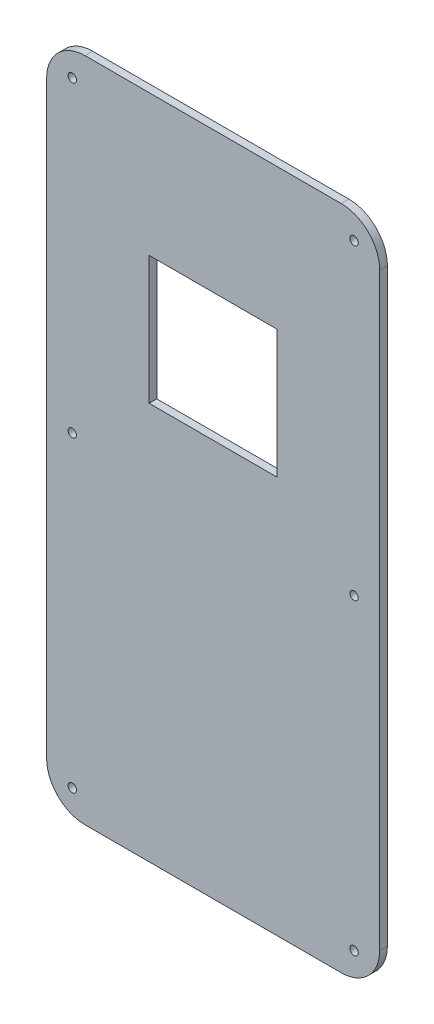
ISO-10303-21;
HEADER;
FILE_DESCRIPTION(('STEP AP214'),'2;1');
FILE_NAME('part.step','',(''),(''),'','','');
FILE_SCHEMA(('AUTOMOTIVE_DESIGN { 1 0 10303 214 1 1 1 1 }'));
ENDSEC;
DATA;
#1=APPLICATION_CONTEXT('core data for automotive mechanical design processes');
#2=APPLICATION_PROTOCOL_DEFINITION('international standard','automotive_design',2000,#1);
#3=PRODUCT_CONTEXT('',#1,'mechanical');
#4=PRODUCT('Part','Part','',(#3));
#5=PRODUCT_RELATED_PRODUCT_CATEGORY('part','',(#4));
#6=PRODUCT_DEFINITION_FORMATION('','',#4);
#7=PRODUCT_DEFINITION_CONTEXT('part definition',#1,'design');
#8=PRODUCT_DEFINITION('design','',#6,#7);
#9=PRODUCT_DEFINITION_SHAPE('','',#8);
#10=(LENGTH_UNIT() NAMED_UNIT(*) SI_UNIT(.MILLI.,.METRE.));
#11=(NAMED_UNIT(*) PLANE_ANGLE_UNIT() SI_UNIT($,.RADIAN.));
#12=(NAMED_UNIT(*) SI_UNIT($,.STERADIAN.) SOLID_ANGLE_UNIT());
#13=UNCERTAINTY_MEASURE_WITH_UNIT(LENGTH_MEASURE(1.E-05),#10,'distance_accuracy_value','');
#14=(GEOMETRIC_REPRESENTATION_CONTEXT(3) GLOBAL_UNCERTAINTY_ASSIGNED_CONTEXT((#13)) GLOBAL_UNIT_ASSIGNED_CONTEXT((#10,
#11,#12)) REPRESENTATION_CONTEXT('',''));
#15=CARTESIAN_POINT('',(0.,0.,0.));
#16=DIRECTION('',(0.,0.,1.));
#17=DIRECTION('',(1.,0.,0.));
#18=AXIS2_PLACEMENT_3D('',#15,#16,#17);
#19=CARTESIAN_POINT('',(0.,0.,3.));
#20=DIRECTION('',(-1.,0.,0.));
#21=DIRECTION('',(0.,0.,1.));
#22=AXIS2_PLACEMENT_3D('',#19,#20,#21);
#23=PLANE('',#22);
#24=DIRECTION('',(0.,1.,0.));
#25=VECTOR('',#24,1.);
#26=CARTESIAN_POINT('',(0.,0.,3.));
#27=LINE('',#26,#25);
#28=CARTESIAN_POINT('',(0.,15.,3.));
#29=VERTEX_POINT('',#28);
#30=CARTESIAN_POINT('',(0.,245.,3.));
#31=VERTEX_POINT('',#30);
#32=EDGE_CURVE('E210',#29,#31,#27,.T.);
#33=ORIENTED_EDGE('',*,*,#32,.T.);
#34=DIRECTION('',(0.,0.,-1.));
#35=VECTOR('',#34,1.);
#36=CARTESIAN_POINT('',(0.,245.,3.));
#37=LINE('',#36,#35);
#38=CARTESIAN_POINT('',(0.,245.,0.));
#39=VERTEX_POINT('',#38);
#40=EDGE_CURVE('E232',#31,#39,#37,.T.);
#41=ORIENTED_EDGE('',*,*,#40,.T.);
#42=DIRECTION('',(0.,1.,0.));
#43=VECTOR('',#42,1.);
#44=CARTESIAN_POINT('',(0.,0.,0.));
#45=LINE('',#44,#43);
#46=CARTESIAN_POINT('',(0.,15.,0.));
#47=VERTEX_POINT('',#46);
#48=EDGE_CURVE('E207',#47,#39,#45,.T.);
#49=ORIENTED_EDGE('',*,*,#48,.F.);
#50=DIRECTION('',(0.,0.,-1.));
#51=VECTOR('',#50,1.);
#52=CARTESIAN_POINT('',(0.,15.,3.));
#53=LINE('',#52,#51);
#54=EDGE_CURVE('E221',#47,#29,#53,.F.);
#55=ORIENTED_EDGE('',*,*,#54,.T.);
#56=EDGE_LOOP('',(#33,#41,#49,#55));
#57=FACE_BOUND('',#56,.T.);
#58=ADVANCED_FACE('F39',(#57),#23,.T.);
#59=CARTESIAN_POINT('',(0.,0.,3.));
#60=DIRECTION('',(0.,1.,0.));
#61=DIRECTION('',(0.,0.,1.));
#62=AXIS2_PLACEMENT_3D('',#59,#60,#61);
#63=PLANE('',#62);
#64=DIRECTION('',(1.,0.,0.));
#65=VECTOR('',#64,1.);
#66=CARTESIAN_POINT('',(0.,0.,3.));
#67=LINE('',#66,#65);
#68=CARTESIAN_POINT('',(15.,0.,3.));
#69=VERTEX_POINT('',#68);
#70=CARTESIAN_POINT('',(115.,0.,3.));
#71=VERTEX_POINT('',#70);
#72=EDGE_CURVE('E219',#69,#71,#67,.T.);
#73=ORIENTED_EDGE('',*,*,#72,.F.);
#74=DIRECTION('',(0.,0.,-1.));
#75=VECTOR('',#74,1.);
#76=CARTESIAN_POINT('',(15.,0.,0.));
#77=LINE('',#76,#75);
#78=CARTESIAN_POINT('',(15.,0.,0.));
#79=VERTEX_POINT('',#78);
#80=EDGE_CURVE('E257',#69,#79,#77,.T.);
#81=ORIENTED_EDGE('',*,*,#80,.T.);
#82=DIRECTION('',(1.,0.,0.));
#83=VECTOR('',#82,1.);
#84=CARTESIAN_POINT('',(0.,0.,0.));
#85=LINE('',#84,#83);
#86=CARTESIAN_POINT('',(115.,0.,0.));
#87=VERTEX_POINT('',#86);
#88=EDGE_CURVE('E214',#79,#87,#85,.T.);
#89=ORIENTED_EDGE('',*,*,#88,.T.);
#90=DIRECTION('',(0.,0.,-1.));
#91=VECTOR('',#90,1.);
#92=CARTESIAN_POINT('',(115.,0.,3.));
#93=LINE('',#92,#91);
#94=EDGE_CURVE('E255',#87,#71,#93,.F.);
#95=ORIENTED_EDGE('',*,*,#94,.T.);
#96=EDGE_LOOP('',(#73,#81,#89,#95));
#97=FACE_BOUND('',#96,.T.);
#98=ADVANCED_FACE('F263',(#97),#63,.F.);
#99=CARTESIAN_POINT('',(130.,0.,3.));
#100=DIRECTION('',(-1.,0.,0.));
#101=DIRECTION('',(0.,0.,1.));
#102=AXIS2_PLACEMENT_3D('',#99,#100,#101);
#103=PLANE('',#102);
#104=DIRECTION('',(0.,1.,0.));
#105=VECTOR('',#104,1.);
#106=CARTESIAN_POINT('',(130.,0.,3.));
#107=LINE('',#106,#105);
#108=CARTESIAN_POINT('',(130.,15.,3.));
#109=VERTEX_POINT('',#108);
#110=CARTESIAN_POINT('',(130.,245.,3.));
#111=VERTEX_POINT('',#110);
#112=EDGE_CURVE('E217',#109,#111,#107,.T.);
#113=ORIENTED_EDGE('',*,*,#112,.F.);
#114=DIRECTION('',(0.,0.,-1.));
#115=VECTOR('',#114,1.);
#116=CARTESIAN_POINT('',(130.,15.,3.));
#117=LINE('',#116,#115);
#118=CARTESIAN_POINT('',(130.,15.,0.));
#119=VERTEX_POINT('',#118);
#120=EDGE_CURVE('E11',#109,#119,#117,.T.);
#121=ORIENTED_EDGE('',*,*,#120,.T.);
#122=DIRECTION('',(0.,1.,0.));
#123=VECTOR('',#122,1.);
#124=CARTESIAN_POINT('',(130.,0.,0.));
#125=LINE('',#124,#123);
#126=CARTESIAN_POINT('',(130.,245.,0.));
#127=VERTEX_POINT('',#126);
#128=EDGE_CURVE('E227',#119,#127,#125,.T.);
#129=ORIENTED_EDGE('',*,*,#128,.T.);
#130=DIRECTION('',(0.,0.,-1.));
#131=VECTOR('',#130,1.);
#132=CARTESIAN_POINT('',(130.,245.,3.));
#133=LINE('',#132,#131);
#134=EDGE_CURVE('E47',#127,#111,#133,.F.);
#135=ORIENTED_EDGE('',*,*,#134,.T.);
#136=EDGE_LOOP('',(#113,#121,#129,#135));
#137=FACE_BOUND('',#136,.T.);
#138=ADVANCED_FACE('F273',(#137),#103,.F.);
#139=CARTESIAN_POINT('',(0.,260.,3.));
#140=DIRECTION('',(0.,1.,0.));
#141=DIRECTION('',(0.,0.,1.));
#142=AXIS2_PLACEMENT_3D('',#139,#140,#141);
#143=PLANE('',#142);
#144=DIRECTION('',(1.,0.,0.));
#145=VECTOR('',#144,1.);
#146=CARTESIAN_POINT('',(0.,260.,0.));
#147=LINE('',#146,#145);
#148=CARTESIAN_POINT('',(15.,260.,0.));
#149=VERTEX_POINT('',#148);
#150=CARTESIAN_POINT('',(115.,260.,0.));
#151=VERTEX_POINT('',#150);
#152=EDGE_CURVE('E224',#149,#151,#147,.T.);
#153=ORIENTED_EDGE('',*,*,#152,.F.);
#154=DIRECTION('',(0.,0.,-1.));
#155=VECTOR('',#154,1.);
#156=CARTESIAN_POINT('',(15.,260.,3.));
#157=LINE('',#156,#155);
#158=CARTESIAN_POINT('',(15.,260.,3.));
#159=VERTEX_POINT('',#158);
#160=EDGE_CURVE('E246',#149,#159,#157,.F.);
#161=ORIENTED_EDGE('',*,*,#160,.T.);
#162=DIRECTION('',(1.,0.,0.));
#163=VECTOR('',#162,1.);
#164=CARTESIAN_POINT('',(0.,260.,3.));
#165=LINE('',#164,#163);
#166=CARTESIAN_POINT('',(115.,260.,3.));
#167=VERTEX_POINT('',#166);
#168=EDGE_CURVE('E213',#159,#167,#165,.T.);
#169=ORIENTED_EDGE('',*,*,#168,.T.);
#170=DIRECTION('',(0.,0.,-1.));
#171=VECTOR('',#170,1.);
#172=CARTESIAN_POINT('',(115.,260.,0.));
#173=LINE('',#172,#171);
#174=EDGE_CURVE('E243',#167,#151,#173,.T.);
#175=ORIENTED_EDGE('',*,*,#174,.T.);
#176=EDGE_LOOP('',(#153,#161,#169,#175));
#177=FACE_BOUND('',#176,.T.);
#178=ADVANCED_FACE('F281',(#177),#143,.T.);
#179=CARTESIAN_POINT('',(0.,0.,3.));
#180=DIRECTION('',(0.,0.,-1.));
#181=DIRECTION('',(-1.,0.,0.));
#182=AXIS2_PLACEMENT_3D('',#179,#180,#181);
#183=PLANE('',#182);
#184=DIRECTION('',(1.,0.,0.));
#185=VECTOR('',#184,1.);
#186=CARTESIAN_POINT('',(0.,205.,3.));
#187=LINE('',#186,#185);
#188=CARTESIAN_POINT('',(40.,205.,3.));
#189=VERTEX_POINT('',#188);
#190=CARTESIAN_POINT('',(90.,205.,3.));
#191=VERTEX_POINT('',#190);
#192=EDGE_CURVE('E167',#189,#191,#187,.T.);
#193=ORIENTED_EDGE('',*,*,#192,.T.);
#194=DIRECTION('',(0.,-1.,0.));
#195=VECTOR('',#194,1.);
#196=CARTESIAN_POINT('',(90.,0.,3.));
#197=LINE('',#196,#195);
#198=CARTESIAN_POINT('',(90.,155.,3.));
#199=VERTEX_POINT('',#198);
#200=EDGE_CURVE('E170',#191,#199,#197,.T.);
#201=ORIENTED_EDGE('',*,*,#200,.T.);
#202=DIRECTION('',(-1.,0.,0.));
#203=VECTOR('',#202,1.);
#204=CARTESIAN_POINT('',(0.,155.,3.));
#205=LINE('',#204,#203);
#206=CARTESIAN_POINT('',(40.,155.,3.));
#207=VERTEX_POINT('',#206);
#208=EDGE_CURVE('E162',#199,#207,#205,.T.);
#209=ORIENTED_EDGE('',*,*,#208,.T.);
#210=DIRECTION('',(0.,1.,0.));
#211=VECTOR('',#210,1.);
#212=CARTESIAN_POINT('',(40.,0.,3.));
#213=LINE('',#212,#211);
#214=EDGE_CURVE('E137',#207,#189,#213,.T.);
#215=ORIENTED_EDGE('',*,*,#214,.T.);
#216=EDGE_LOOP('',(#193,#201,#209,#215));
#217=FACE_BOUND('',#216,.T.);
#218=CARTESIAN_POINT('',(10.,10.,3.));
#219=DIRECTION('',(0.,0.,1.));
#220=DIRECTION('',(1.,0.,0.));
#221=AXIS2_PLACEMENT_3D('',#218,#219,#220);
#222=CIRCLE('',#221,1.65);
#223=CARTESIAN_POINT('',(11.65,10.,3.));
#224=VERTEX_POINT('',#223);
#225=EDGE_CURVE('E180',#224,#224,#222,.T.);
#226=ORIENTED_EDGE('',*,*,#225,.F.);
#227=EDGE_LOOP('',(#226));
#228=FACE_BOUND('',#227,.T.);
#229=CARTESIAN_POINT('',(10.,250.,3.));
#230=DIRECTION('',(0.,0.,1.));
#231=DIRECTION('',(-1.,0.,0.));
#232=AXIS2_PLACEMENT_3D('',#229,#230,#231);
#233=CIRCLE('',#232,1.65);
#234=CARTESIAN_POINT('',(8.35,250.,3.));
#235=VERTEX_POINT('',#234);
#236=EDGE_CURVE('E187',#235,#235,#233,.T.);
#237=ORIENTED_EDGE('',*,*,#236,.F.);
#238=EDGE_LOOP('',(#237));
#239=FACE_BOUND('',#238,.T.);
#240=CARTESIAN_POINT('',(120.,250.,3.));
#241=DIRECTION('',(0.,0.,1.));
#242=DIRECTION('',(-1.,0.,0.));
#243=AXIS2_PLACEMENT_3D('',#240,#241,#242);
#244=CIRCLE('',#243,1.65);
#245=CARTESIAN_POINT('',(118.35,250.,3.));
#246=VERTEX_POINT('',#245);
#247=EDGE_CURVE('E193',#246,#246,#244,.T.);
#248=ORIENTED_EDGE('',*,*,#247,.F.);
#249=EDGE_LOOP('',(#248));
#250=FACE_BOUND('',#249,.T.);
#251=CARTESIAN_POINT('',(120.,130.,3.));
#252=DIRECTION('',(0.,0.,1.));
#253=DIRECTION('',(1.,0.,0.));
#254=AXIS2_PLACEMENT_3D('',#251,#252,#253);
#255=CIRCLE('',#254,1.6);
#256=CARTESIAN_POINT('',(121.6,130.,3.));
#257=VERTEX_POINT('',#256);
#258=EDGE_CURVE('E199',#257,#257,#255,.T.);
#259=ORIENTED_EDGE('',*,*,#258,.F.);
#260=EDGE_LOOP('',(#259));
#261=FACE_BOUND('',#260,.T.);
#262=CARTESIAN_POINT('',(10.,130.,3.));
#263=DIRECTION('',(0.,0.,1.));
#264=DIRECTION('',(1.,0.,0.));
#265=AXIS2_PLACEMENT_3D('',#262,#263,#264);
#266=CIRCLE('',#265,1.605);
#267=CARTESIAN_POINT('',(11.605,130.,3.));
#268=VERTEX_POINT('',#267);
#269=EDGE_CURVE('E174',#268,#268,#266,.T.);
#270=ORIENTED_EDGE('',*,*,#269,.F.);
#271=EDGE_LOOP('',(#270));
#272=FACE_BOUND('',#271,.T.);
#273=CARTESIAN_POINT('',(120.,10.,3.));
#274=DIRECTION('',(0.,0.,1.));
#275=DIRECTION('',(1.,0.,0.));
#276=AXIS2_PLACEMENT_3D('',#273,#274,#275);
#277=CIRCLE('',#276,1.65);
#278=CARTESIAN_POINT('',(121.65,10.,3.));
#279=VERTEX_POINT('',#278);
#280=EDGE_CURVE('E183',#279,#279,#277,.T.);
#281=ORIENTED_EDGE('',*,*,#280,.F.);
#282=EDGE_LOOP('',(#281));
#283=FACE_BOUND('',#282,.T.);
#284=ORIENTED_EDGE('',*,*,#168,.F.);
#285=CARTESIAN_POINT('',(15.,245.,3.));
#286=DIRECTION('',(0.,0.,-1.));
#287=DIRECTION('',(-1.,0.,0.));
#288=AXIS2_PLACEMENT_3D('',#285,#286,#287);
#289=CIRCLE('',#288,15.);
#290=EDGE_CURVE('E253',#159,#31,#289,.F.);
#291=ORIENTED_EDGE('',*,*,#290,.T.);
#292=ORIENTED_EDGE('',*,*,#32,.F.);
#293=CARTESIAN_POINT('',(15.,15.,3.));
#294=DIRECTION('',(0.,0.,-1.));
#295=DIRECTION('',(-1.,0.,0.));
#296=AXIS2_PLACEMENT_3D('',#293,#294,#295);
#297=CIRCLE('',#296,15.);
#298=EDGE_CURVE('E251',#29,#69,#297,.F.);
#299=ORIENTED_EDGE('',*,*,#298,.T.);
#300=ORIENTED_EDGE('',*,*,#72,.T.);
#301=CARTESIAN_POINT('',(115.,15.,3.));
#302=DIRECTION('',(0.,0.,-1.));
#303=DIRECTION('',(-1.,0.,0.));
#304=AXIS2_PLACEMENT_3D('',#301,#302,#303);
#305=CIRCLE('',#304,15.);
#306=EDGE_CURVE('E60',#71,#109,#305,.F.);
#307=ORIENTED_EDGE('',*,*,#306,.T.);
#308=ORIENTED_EDGE('',*,*,#112,.T.);
#309=CARTESIAN_POINT('',(115.,245.,3.));
#310=DIRECTION('',(0.,0.,-1.));
#311=DIRECTION('',(-1.,0.,0.));
#312=AXIS2_PLACEMENT_3D('',#309,#310,#311);
#313=CIRCLE('',#312,15.);
#314=EDGE_CURVE('E248',#111,#167,#313,.F.);
#315=ORIENTED_EDGE('',*,*,#314,.T.);
#316=EDGE_LOOP('',(#284,#291,#292,#299,#300,#307,#308,#315));
#317=FACE_BOUND('',#316,.T.);
#318=ADVANCED_FACE('F276',(#217,#228,#239,#250,#261,#272,#283,#317),#183,.F.);
#319=CARTESIAN_POINT('',(0.,0.,0.));
#320=DIRECTION('',(0.,0.,-1.));
#321=DIRECTION('',(-1.,0.,0.));
#322=AXIS2_PLACEMENT_3D('',#319,#320,#321);
#323=PLANE('',#322);
#324=DIRECTION('',(0.,-1.,0.));
#325=VECTOR('',#324,1.);
#326=CARTESIAN_POINT('',(90.,155.,0.));
#327=LINE('',#326,#325);
#328=CARTESIAN_POINT('',(90.,205.,0.));
#329=VERTEX_POINT('',#328);
#330=CARTESIAN_POINT('',(90.,155.,0.));
#331=VERTEX_POINT('',#330);
#332=EDGE_CURVE('E150',#329,#331,#327,.T.);
#333=ORIENTED_EDGE('',*,*,#332,.F.);
#334=DIRECTION('',(1.,0.,0.));
#335=VECTOR('',#334,1.);
#336=CARTESIAN_POINT('',(90.,205.,0.));
#337=LINE('',#336,#335);
#338=CARTESIAN_POINT('',(40.,205.,0.));
#339=VERTEX_POINT('',#338);
#340=EDGE_CURVE('E155',#339,#329,#337,.T.);
#341=ORIENTED_EDGE('',*,*,#340,.F.);
#342=DIRECTION('',(0.,1.,0.));
#343=VECTOR('',#342,1.);
#344=CARTESIAN_POINT('',(40.,155.,0.));
#345=LINE('',#344,#343);
#346=CARTESIAN_POINT('',(40.,155.,0.));
#347=VERTEX_POINT('',#346);
#348=EDGE_CURVE('E134',#347,#339,#345,.T.);
#349=ORIENTED_EDGE('',*,*,#348,.F.);
#350=DIRECTION('',(-1.,0.,0.));
#351=VECTOR('',#350,1.);
#352=CARTESIAN_POINT('',(90.,155.,0.));
#353=LINE('',#352,#351);
#354=EDGE_CURVE('E145',#331,#347,#353,.T.);
#355=ORIENTED_EDGE('',*,*,#354,.F.);
#356=EDGE_LOOP('',(#333,#341,#349,#355));
#357=FACE_BOUND('',#356,.T.);
#358=CARTESIAN_POINT('',(10.,10.,0.));
#359=DIRECTION('',(0.,0.,1.));
#360=DIRECTION('',(1.,0.,0.));
#361=AXIS2_PLACEMENT_3D('',#358,#359,#360);
#362=CIRCLE('',#361,1.65);
#363=CARTESIAN_POINT('',(11.65,10.,0.));
#364=VERTEX_POINT('',#363);
#365=EDGE_CURVE('E184',#364,#364,#362,.T.);
#366=ORIENTED_EDGE('',*,*,#365,.T.);
#367=EDGE_LOOP('',(#366));
#368=FACE_BOUND('',#367,.T.);
#369=CARTESIAN_POINT('',(10.,250.,0.));
#370=DIRECTION('',(0.,0.,1.));
#371=DIRECTION('',(-1.,0.,0.));
#372=AXIS2_PLACEMENT_3D('',#369,#370,#371);
#373=CIRCLE('',#372,1.65);
#374=CARTESIAN_POINT('',(8.35,250.,0.));
#375=VERTEX_POINT('',#374);
#376=EDGE_CURVE('E190',#375,#375,#373,.T.);
#377=ORIENTED_EDGE('',*,*,#376,.T.);
#378=EDGE_LOOP('',(#377));
#379=FACE_BOUND('',#378,.T.);
#380=CARTESIAN_POINT('',(120.,250.,0.));
#381=DIRECTION('',(0.,0.,1.));
#382=DIRECTION('',(-1.,0.,0.));
#383=AXIS2_PLACEMENT_3D('',#380,#381,#382);
#384=CIRCLE('',#383,1.65);
#385=CARTESIAN_POINT('',(118.35,250.,0.));
#386=VERTEX_POINT('',#385);
#387=EDGE_CURVE('E196',#386,#386,#384,.T.);
#388=ORIENTED_EDGE('',*,*,#387,.T.);
#389=EDGE_LOOP('',(#388));
#390=FACE_BOUND('',#389,.T.);
#391=CARTESIAN_POINT('',(120.,130.,0.));
#392=DIRECTION('',(0.,0.,1.));
#393=DIRECTION('',(1.,0.,0.));
#394=AXIS2_PLACEMENT_3D('',#391,#392,#393);
#395=CIRCLE('',#394,1.6);
#396=CARTESIAN_POINT('',(121.6,130.,0.));
#397=VERTEX_POINT('',#396);
#398=EDGE_CURVE('E177',#397,#397,#395,.T.);
#399=ORIENTED_EDGE('',*,*,#398,.T.);
#400=EDGE_LOOP('',(#399));
#401=FACE_BOUND('',#400,.T.);
#402=CARTESIAN_POINT('',(10.,130.,0.));
#403=DIRECTION('',(0.,0.,1.));
#404=DIRECTION('',(1.,0.,0.));
#405=AXIS2_PLACEMENT_3D('',#402,#403,#404);
#406=CIRCLE('',#405,1.605);
#407=CARTESIAN_POINT('',(11.605,130.,0.));
#408=VERTEX_POINT('',#407);
#409=EDGE_CURVE('E173',#408,#408,#406,.T.);
#410=ORIENTED_EDGE('',*,*,#409,.T.);
#411=EDGE_LOOP('',(#410));
#412=FACE_BOUND('',#411,.T.);
#413=CARTESIAN_POINT('',(120.,10.,0.));
#414=DIRECTION('',(0.,0.,1.));
#415=DIRECTION('',(1.,0.,0.));
#416=AXIS2_PLACEMENT_3D('',#413,#414,#415);
#417=CIRCLE('',#416,1.65);
#418=CARTESIAN_POINT('',(121.65,10.,0.));
#419=VERTEX_POINT('',#418);
#420=EDGE_CURVE('E204',#419,#419,#417,.T.);
#421=ORIENTED_EDGE('',*,*,#420,.T.);
#422=EDGE_LOOP('',(#421));
#423=FACE_BOUND('',#422,.T.);
#424=ORIENTED_EDGE('',*,*,#48,.T.);
#425=CARTESIAN_POINT('',(15.,245.,0.));
#426=DIRECTION('',(0.,0.,-1.));
#427=DIRECTION('',(-1.,0.,0.));
#428=AXIS2_PLACEMENT_3D('',#425,#426,#427);
#429=CIRCLE('',#428,15.);
#430=EDGE_CURVE('E241',#39,#149,#429,.T.);
#431=ORIENTED_EDGE('',*,*,#430,.T.);
#432=ORIENTED_EDGE('',*,*,#152,.T.);
#433=CARTESIAN_POINT('',(115.,245.,0.));
#434=DIRECTION('',(0.,0.,-1.));
#435=DIRECTION('',(-1.,0.,0.));
#436=AXIS2_PLACEMENT_3D('',#433,#434,#435);
#437=CIRCLE('',#436,15.);
#438=EDGE_CURVE('E235',#151,#127,#437,.T.);
#439=ORIENTED_EDGE('',*,*,#438,.T.);
#440=ORIENTED_EDGE('',*,*,#128,.F.);
#441=CARTESIAN_POINT('',(115.,15.,0.));
#442=DIRECTION('',(0.,0.,-1.));
#443=DIRECTION('',(-1.,0.,0.));
#444=AXIS2_PLACEMENT_3D('',#441,#442,#443);
#445=CIRCLE('',#444,15.);
#446=EDGE_CURVE('E237',#119,#87,#445,.T.);
#447=ORIENTED_EDGE('',*,*,#446,.T.);
#448=ORIENTED_EDGE('',*,*,#88,.F.);
#449=CARTESIAN_POINT('',(15.,15.,0.));
#450=DIRECTION('',(0.,0.,-1.));
#451=DIRECTION('',(-1.,0.,0.));
#452=AXIS2_PLACEMENT_3D('',#449,#450,#451);
#453=CIRCLE('',#452,15.);
#454=EDGE_CURVE('E239',#79,#47,#453,.T.);
#455=ORIENTED_EDGE('',*,*,#454,.T.);
#456=EDGE_LOOP('',(#424,#431,#432,#439,#440,#447,#448,#455));
#457=FACE_BOUND('',#456,.T.);
#458=ADVANCED_FACE('F152',(#357,#368,#379,#390,#401,#412,#423,#457),#323,.T.);
#459=CARTESIAN_POINT('',(120.,10.,0.));
#460=DIRECTION('',(0.,0.,1.));
#461=DIRECTION('',(1.,0.,0.));
#462=AXIS2_PLACEMENT_3D('',#459,#460,#461);
#463=CYLINDRICAL_SURFACE('',#462,1.65);
#464=ORIENTED_EDGE('',*,*,#420,.F.);
#465=EDGE_LOOP('',(#464));
#466=FACE_BOUND('',#465,.T.);
#467=ORIENTED_EDGE('',*,*,#280,.T.);
#468=EDGE_LOOP('',(#467));
#469=FACE_BOUND('',#468,.T.);
#470=ADVANCED_FACE('F312',(#466,#469),#463,.F.);
#471=CARTESIAN_POINT('',(10.,130.,0.));
#472=DIRECTION('',(0.,0.,1.));
#473=DIRECTION('',(1.,0.,0.));
#474=AXIS2_PLACEMENT_3D('',#471,#472,#473);
#475=CYLINDRICAL_SURFACE('',#474,1.605);
#476=ORIENTED_EDGE('',*,*,#409,.F.);
#477=EDGE_LOOP('',(#476));
#478=FACE_BOUND('',#477,.T.);
#479=ORIENTED_EDGE('',*,*,#269,.T.);
#480=EDGE_LOOP('',(#479));
#481=FACE_BOUND('',#480,.T.);
#482=ADVANCED_FACE('F318',(#478,#481),#475,.F.);
#483=CARTESIAN_POINT('',(120.,130.,0.));
#484=DIRECTION('',(0.,0.,1.));
#485=DIRECTION('',(1.,0.,0.));
#486=AXIS2_PLACEMENT_3D('',#483,#484,#485);
#487=CYLINDRICAL_SURFACE('',#486,1.6);
#488=ORIENTED_EDGE('',*,*,#398,.F.);
#489=EDGE_LOOP('',(#488));
#490=FACE_BOUND('',#489,.T.);
#491=ORIENTED_EDGE('',*,*,#258,.T.);
#492=EDGE_LOOP('',(#491));
#493=FACE_BOUND('',#492,.T.);
#494=ADVANCED_FACE('F320',(#490,#493),#487,.F.);
#495=CARTESIAN_POINT('',(120.,250.,0.));
#496=DIRECTION('',(0.,0.,1.));
#497=DIRECTION('',(1.,0.,0.));
#498=AXIS2_PLACEMENT_3D('',#495,#496,#497);
#499=CYLINDRICAL_SURFACE('',#498,1.65);
#500=ORIENTED_EDGE('',*,*,#387,.F.);
#501=EDGE_LOOP('',(#500));
#502=FACE_BOUND('',#501,.T.);
#503=ORIENTED_EDGE('',*,*,#247,.T.);
#504=EDGE_LOOP('',(#503));
#505=FACE_BOUND('',#504,.T.);
#506=ADVANCED_FACE('F323',(#502,#505),#499,.F.);
#507=CARTESIAN_POINT('',(10.,250.,0.));
#508=DIRECTION('',(0.,0.,1.));
#509=DIRECTION('',(1.,0.,0.));
#510=AXIS2_PLACEMENT_3D('',#507,#508,#509);
#511=CYLINDRICAL_SURFACE('',#510,1.65);
#512=ORIENTED_EDGE('',*,*,#376,.F.);
#513=EDGE_LOOP('',(#512));
#514=FACE_BOUND('',#513,.T.);
#515=ORIENTED_EDGE('',*,*,#236,.T.);
#516=EDGE_LOOP('',(#515));
#517=FACE_BOUND('',#516,.T.);
#518=ADVANCED_FACE('F327',(#514,#517),#511,.F.);
#519=CARTESIAN_POINT('',(10.,10.,0.));
#520=DIRECTION('',(0.,0.,1.));
#521=DIRECTION('',(1.,0.,0.));
#522=AXIS2_PLACEMENT_3D('',#519,#520,#521);
#523=CYLINDRICAL_SURFACE('',#522,1.65);
#524=ORIENTED_EDGE('',*,*,#365,.F.);
#525=EDGE_LOOP('',(#524));
#526=FACE_BOUND('',#525,.T.);
#527=ORIENTED_EDGE('',*,*,#225,.T.);
#528=EDGE_LOOP('',(#527));
#529=FACE_BOUND('',#528,.T.);
#530=ADVANCED_FACE('F331',(#526,#529),#523,.F.);
#531=CARTESIAN_POINT('',(90.,155.,10.));
#532=DIRECTION('',(1.,0.,0.));
#533=DIRECTION('',(0.,0.,-1.));
#534=AXIS2_PLACEMENT_3D('',#531,#532,#533);
#535=PLANE('',#534);
#536=DIRECTION('',(0.,0.,-1.));
#537=VECTOR('',#536,1.);
#538=CARTESIAN_POINT('',(90.,205.,10.));
#539=LINE('',#538,#537);
#540=EDGE_CURVE('E160',#191,#329,#539,.T.);
#541=ORIENTED_EDGE('',*,*,#540,.T.);
#542=ORIENTED_EDGE('',*,*,#332,.T.);
#543=DIRECTION('',(0.,0.,-1.));
#544=VECTOR('',#543,1.);
#545=CARTESIAN_POINT('',(90.,155.,10.));
#546=LINE('',#545,#544);
#547=EDGE_CURVE('E141',#199,#331,#546,.T.);
#548=ORIENTED_EDGE('',*,*,#547,.F.);
#549=ORIENTED_EDGE('',*,*,#200,.F.);
#550=EDGE_LOOP('',(#541,#542,#548,#549));
#551=FACE_BOUND('',#550,.T.);
#552=ADVANCED_FACE('F335',(#551),#535,.F.);
#553=CARTESIAN_POINT('',(90.,205.,10.));
#554=DIRECTION('',(0.,1.,0.));
#555=DIRECTION('',(0.,0.,1.));
#556=AXIS2_PLACEMENT_3D('',#553,#554,#555);
#557=PLANE('',#556);
#558=DIRECTION('',(0.,0.,-1.));
#559=VECTOR('',#558,1.);
#560=CARTESIAN_POINT('',(40.,205.,10.));
#561=LINE('',#560,#559);
#562=EDGE_CURVE('E140',#189,#339,#561,.T.);
#563=ORIENTED_EDGE('',*,*,#562,.T.);
#564=ORIENTED_EDGE('',*,*,#340,.T.);
#565=ORIENTED_EDGE('',*,*,#540,.F.);
#566=ORIENTED_EDGE('',*,*,#192,.F.);
#567=EDGE_LOOP('',(#563,#564,#565,#566));
#568=FACE_BOUND('',#567,.T.);
#569=ADVANCED_FACE('F342',(#568),#557,.F.);
#570=CARTESIAN_POINT('',(40.,155.,10.));
#571=DIRECTION('',(-1.,0.,0.));
#572=DIRECTION('',(0.,0.,1.));
#573=AXIS2_PLACEMENT_3D('',#570,#571,#572);
#574=PLANE('',#573);
#575=DIRECTION('',(0.,0.,-1.));
#576=VECTOR('',#575,1.);
#577=CARTESIAN_POINT('',(40.,155.,10.));
#578=LINE('',#577,#576);
#579=EDGE_CURVE('E129',#207,#347,#578,.T.);
#580=ORIENTED_EDGE('',*,*,#579,.T.);
#581=ORIENTED_EDGE('',*,*,#348,.T.);
#582=ORIENTED_EDGE('',*,*,#562,.F.);
#583=ORIENTED_EDGE('',*,*,#214,.F.);
#584=EDGE_LOOP('',(#580,#581,#582,#583));
#585=FACE_BOUND('',#584,.T.);
#586=ADVANCED_FACE('F131',(#585),#574,.F.);
#587=CARTESIAN_POINT('',(90.,155.,10.));
#588=DIRECTION('',(0.,-1.,0.));
#589=DIRECTION('',(0.,0.,-1.));
#590=AXIS2_PLACEMENT_3D('',#587,#588,#589);
#591=PLANE('',#590);
#592=ORIENTED_EDGE('',*,*,#547,.T.);
#593=ORIENTED_EDGE('',*,*,#354,.T.);
#594=ORIENTED_EDGE('',*,*,#579,.F.);
#595=ORIENTED_EDGE('',*,*,#208,.F.);
#596=EDGE_LOOP('',(#592,#593,#594,#595));
#597=FACE_BOUND('',#596,.T.);
#598=ADVANCED_FACE('F146',(#597),#591,.F.);
#599=CARTESIAN_POINT('',(15.,245.,3.));
#600=DIRECTION('',(0.,0.,-1.));
#601=DIRECTION('',(-1.,0.,0.));
#602=AXIS2_PLACEMENT_3D('',#599,#600,#601);
#603=CYLINDRICAL_SURFACE('',#602,15.);
#604=ORIENTED_EDGE('',*,*,#290,.F.);
#605=ORIENTED_EDGE('',*,*,#160,.F.);
#606=ORIENTED_EDGE('',*,*,#430,.F.);
#607=ORIENTED_EDGE('',*,*,#40,.F.);
#608=EDGE_LOOP('',(#604,#605,#606,#607));
#609=FACE_BOUND('',#608,.T.);
#610=ADVANCED_FACE('F286',(#609),#603,.T.);
#611=CARTESIAN_POINT('',(15.,15.,3.));
#612=DIRECTION('',(0.,0.,1.));
#613=DIRECTION('',(1.,0.,0.));
#614=AXIS2_PLACEMENT_3D('',#611,#612,#613);
#615=CYLINDRICAL_SURFACE('',#614,15.);
#616=ORIENTED_EDGE('',*,*,#298,.F.);
#617=ORIENTED_EDGE('',*,*,#54,.F.);
#618=ORIENTED_EDGE('',*,*,#454,.F.);
#619=ORIENTED_EDGE('',*,*,#80,.F.);
#620=EDGE_LOOP('',(#616,#617,#618,#619));
#621=FACE_BOUND('',#620,.T.);
#622=ADVANCED_FACE('F290',(#621),#615,.T.);
#623=CARTESIAN_POINT('',(115.,15.,3.));
#624=DIRECTION('',(0.,0.,-1.));
#625=DIRECTION('',(-1.,0.,0.));
#626=AXIS2_PLACEMENT_3D('',#623,#624,#625);
#627=CYLINDRICAL_SURFACE('',#626,15.);
#628=ORIENTED_EDGE('',*,*,#306,.F.);
#629=ORIENTED_EDGE('',*,*,#94,.F.);
#630=ORIENTED_EDGE('',*,*,#446,.F.);
#631=ORIENTED_EDGE('',*,*,#120,.F.);
#632=EDGE_LOOP('',(#628,#629,#630,#631));
#633=FACE_BOUND('',#632,.T.);
#634=ADVANCED_FACE('F272',(#633),#627,.T.);
#635=CARTESIAN_POINT('',(115.,245.,3.));
#636=DIRECTION('',(0.,0.,1.));
#637=DIRECTION('',(1.,0.,0.));
#638=AXIS2_PLACEMENT_3D('',#635,#636,#637);
#639=CYLINDRICAL_SURFACE('',#638,15.);
#640=ORIENTED_EDGE('',*,*,#314,.F.);
#641=ORIENTED_EDGE('',*,*,#134,.F.);
#642=ORIENTED_EDGE('',*,*,#438,.F.);
#643=ORIENTED_EDGE('',*,*,#174,.F.);
#644=EDGE_LOOP('',(#640,#641,#642,#643));
#645=FACE_BOUND('',#644,.T.);
#646=ADVANCED_FACE('F41',(#645),#639,.T.);
#647=CLOSED_SHELL('',(#58,#98,#138,#178,#318,#458,#470,#482,#494,#506,#518,#530,#552,#569,#586,
#598,#610,#622,#634,#646));
#648=MANIFOLD_SOLID_BREP('B2',#647);
#649=ADVANCED_BREP_SHAPE_REPRESENTATION('',(#18,#648),#14);
#650=SHAPE_DEFINITION_REPRESENTATION(#9,#649);
ENDSEC;
END-ISO-10303-21;
